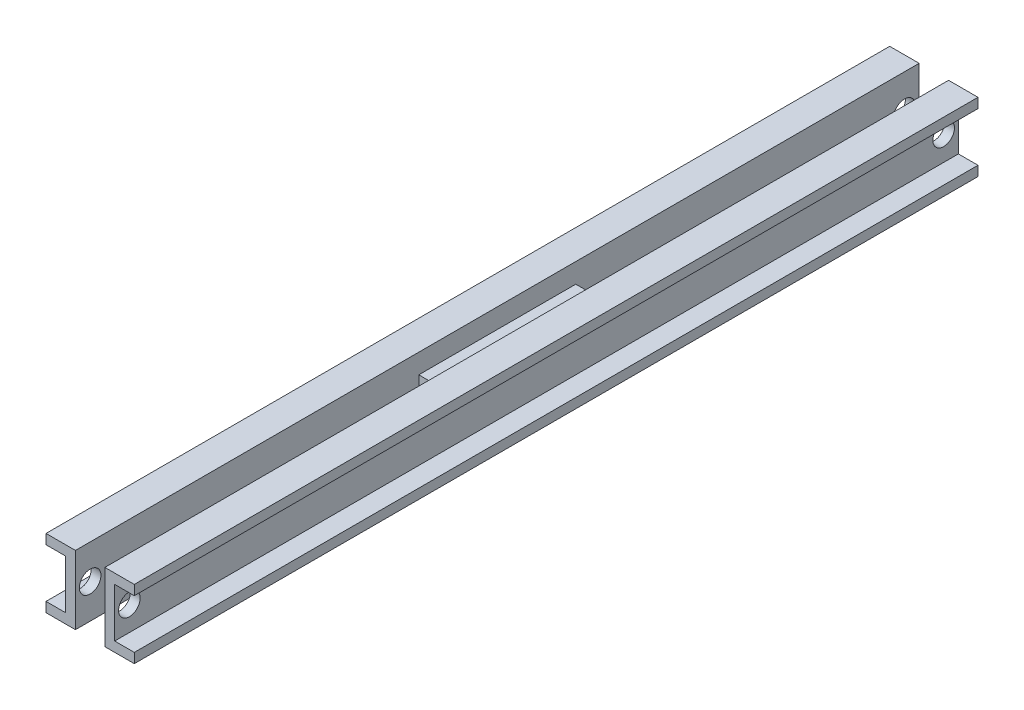
ISO-10303-21;
HEADER;
FILE_DESCRIPTION(('STEP AP214'),'2;1');
FILE_NAME('part.step','',(''),(''),'','','');
FILE_SCHEMA(('AUTOMOTIVE_DESIGN { 1 0 10303 214 1 1 1 1 }'));
ENDSEC;
DATA;
#1=APPLICATION_CONTEXT('core data for automotive mechanical design processes');
#2=APPLICATION_PROTOCOL_DEFINITION('international standard','automotive_design',2000,#1);
#3=PRODUCT_CONTEXT('',#1,'mechanical');
#4=PRODUCT('Part','Part','',(#3));
#5=PRODUCT_RELATED_PRODUCT_CATEGORY('part','',(#4));
#6=PRODUCT_DEFINITION_FORMATION('','',#4);
#7=PRODUCT_DEFINITION_CONTEXT('part definition',#1,'design');
#8=PRODUCT_DEFINITION('design','',#6,#7);
#9=PRODUCT_DEFINITION_SHAPE('','',#8);
#10=(LENGTH_UNIT() NAMED_UNIT(*) SI_UNIT(.MILLI.,.METRE.));
#11=(NAMED_UNIT(*) PLANE_ANGLE_UNIT() SI_UNIT($,.RADIAN.));
#12=(NAMED_UNIT(*) SI_UNIT($,.STERADIAN.) SOLID_ANGLE_UNIT());
#13=UNCERTAINTY_MEASURE_WITH_UNIT(LENGTH_MEASURE(1.E-05),#10,'distance_accuracy_value','');
#14=(GEOMETRIC_REPRESENTATION_CONTEXT(3) GLOBAL_UNCERTAINTY_ASSIGNED_CONTEXT((#13)) GLOBAL_UNIT_ASSIGNED_CONTEXT((#10,
#11,#12)) REPRESENTATION_CONTEXT('',''));
#15=CARTESIAN_POINT('',(0.,0.,0.));
#16=DIRECTION('',(0.,0.,1.));
#17=DIRECTION('',(1.,0.,0.));
#18=AXIS2_PLACEMENT_3D('',#15,#16,#17);
#19=CARTESIAN_POINT('',(0.,0.,-80.));
#20=DIRECTION('',(0.,0.,-1.));
#21=DIRECTION('',(-1.,0.,0.));
#22=AXIS2_PLACEMENT_3D('',#19,#20,#21);
#23=PLANE('',#22);
#24=DIRECTION('',(1.,0.,0.));
#25=VECTOR('',#24,1.);
#26=CARTESIAN_POINT('',(15.,-15.,-80.));
#27=LINE('',#26,#25);
#28=CARTESIAN_POINT('',(-15.,-15.,-80.));
#29=VERTEX_POINT('',#28);
#30=CARTESIAN_POINT('',(15.,-15.,-80.));
#31=VERTEX_POINT('',#30);
#32=EDGE_CURVE('E328',#29,#31,#27,.T.);
#33=ORIENTED_EDGE('',*,*,#32,.F.);
#34=DIRECTION('',(0.,1.,0.));
#35=VECTOR('',#34,1.);
#36=CARTESIAN_POINT('',(-15.,0.,-80.));
#37=LINE('',#36,#35);
#38=CARTESIAN_POINT('',(-15.,15.,-80.));
#39=VERTEX_POINT('',#38);
#40=EDGE_CURVE('E11',#29,#39,#37,.T.);
#41=ORIENTED_EDGE('',*,*,#40,.T.);
#42=DIRECTION('',(-1.,0.,0.));
#43=VECTOR('',#42,1.);
#44=CARTESIAN_POINT('',(15.,15.,-80.));
#45=LINE('',#44,#43);
#46=CARTESIAN_POINT('',(15.,15.,-80.));
#47=VERTEX_POINT('',#46);
#48=EDGE_CURVE('E336',#47,#39,#45,.T.);
#49=ORIENTED_EDGE('',*,*,#48,.F.);
#50=DIRECTION('',(0.,1.,0.));
#51=VECTOR('',#50,1.);
#52=CARTESIAN_POINT('',(15.,35.,-80.));
#53=LINE('',#52,#51);
#54=EDGE_CURVE('E49',#31,#47,#53,.T.);
#55=ORIENTED_EDGE('',*,*,#54,.F.);
#56=EDGE_LOOP('',(#33,#41,#49,#55));
#57=FACE_BOUND('',#56,.T.);
#58=ADVANCED_FACE('F39',(#57),#23,.T.);
#59=CARTESIAN_POINT('',(0.,0.,80.));
#60=DIRECTION('',(0.,0.,-1.));
#61=DIRECTION('',(-1.,0.,0.));
#62=AXIS2_PLACEMENT_3D('',#59,#60,#61);
#63=PLANE('',#62);
#64=DIRECTION('',(0.,-1.,0.));
#65=VECTOR('',#64,1.);
#66=CARTESIAN_POINT('',(15.,35.,80.));
#67=LINE('',#66,#65);
#68=CARTESIAN_POINT('',(15.,15.,80.));
#69=VERTEX_POINT('',#68);
#70=CARTESIAN_POINT('',(15.,-15.,80.));
#71=VERTEX_POINT('',#70);
#72=EDGE_CURVE('E259',#69,#71,#67,.T.);
#73=ORIENTED_EDGE('',*,*,#72,.F.);
#74=DIRECTION('',(-1.,0.,0.));
#75=VECTOR('',#74,1.);
#76=CARTESIAN_POINT('',(15.,15.,80.));
#77=LINE('',#76,#75);
#78=CARTESIAN_POINT('',(-15.,15.,80.));
#79=VERTEX_POINT('',#78);
#80=EDGE_CURVE('E56',#69,#79,#77,.T.);
#81=ORIENTED_EDGE('',*,*,#80,.T.);
#82=DIRECTION('',(0.,1.,0.));
#83=VECTOR('',#82,1.);
#84=CARTESIAN_POINT('',(-15.,35.,80.));
#85=LINE('',#84,#83);
#86=CARTESIAN_POINT('',(-15.,-15.,80.));
#87=VERTEX_POINT('',#86);
#88=EDGE_CURVE('E263',#87,#79,#85,.T.);
#89=ORIENTED_EDGE('',*,*,#88,.F.);
#90=DIRECTION('',(1.,0.,0.));
#91=VECTOR('',#90,1.);
#92=CARTESIAN_POINT('',(15.,-15.,80.));
#93=LINE('',#92,#91);
#94=EDGE_CURVE('E333',#87,#71,#93,.T.);
#95=ORIENTED_EDGE('',*,*,#94,.T.);
#96=EDGE_LOOP('',(#73,#81,#89,#95));
#97=FACE_BOUND('',#96,.T.);
#98=ADVANCED_FACE('F428',(#97),#63,.F.);
#99=CARTESIAN_POINT('',(15.,-15.,80.));
#100=DIRECTION('',(0.,1.,0.));
#101=DIRECTION('',(0.,0.,1.));
#102=AXIS2_PLACEMENT_3D('',#99,#100,#101);
#103=PLANE('',#102);
#104=ORIENTED_EDGE('',*,*,#32,.T.);
#105=DIRECTION('',(0.,0.,-1.));
#106=VECTOR('',#105,1.);
#107=CARTESIAN_POINT('',(15.,-15.,80.));
#108=LINE('',#107,#106);
#109=EDGE_CURVE('E396',#71,#31,#108,.T.);
#110=ORIENTED_EDGE('',*,*,#109,.F.);
#111=ORIENTED_EDGE('',*,*,#94,.F.);
#112=DIRECTION('',(0.,0.,-1.));
#113=VECTOR('',#112,1.);
#114=CARTESIAN_POINT('',(-15.,-15.,80.));
#115=LINE('',#114,#113);
#116=EDGE_CURVE('E332',#87,#29,#115,.T.);
#117=ORIENTED_EDGE('',*,*,#116,.T.);
#118=EDGE_LOOP('',(#104,#110,#111,#117));
#119=FACE_BOUND('',#118,.T.);
#120=ADVANCED_FACE('F41',(#119),#103,.F.);
#121=CARTESIAN_POINT('',(15.,-35.,80.));
#122=DIRECTION('',(0.,1.,0.));
#123=DIRECTION('',(0.,0.,1.));
#124=AXIS2_PLACEMENT_3D('',#121,#122,#123);
#125=PLANE('',#124);
#126=DIRECTION('',(0.,0.,-1.));
#127=VECTOR('',#126,1.);
#128=CARTESIAN_POINT('',(15.,-35.,80.));
#129=LINE('',#128,#127);
#130=CARTESIAN_POINT('',(15.,-35.,430.));
#131=VERTEX_POINT('',#130);
#132=CARTESIAN_POINT('',(15.,-35.,-430.));
#133=VERTEX_POINT('',#132);
#134=EDGE_CURVE('E393',#131,#133,#129,.T.);
#135=ORIENTED_EDGE('',*,*,#134,.T.);
#136=DIRECTION('',(-1.,0.,0.));
#137=VECTOR('',#136,1.);
#138=CARTESIAN_POINT('',(45.,-35.,-430.));
#139=LINE('',#138,#137);
#140=CARTESIAN_POINT('',(45.,-35.,-430.));
#141=VERTEX_POINT('',#140);
#142=EDGE_CURVE('E247',#141,#133,#139,.T.);
#143=ORIENTED_EDGE('',*,*,#142,.F.);
#144=DIRECTION('',(0.,0.,-1.));
#145=VECTOR('',#144,1.);
#146=CARTESIAN_POINT('',(45.,-35.,80.));
#147=LINE('',#146,#145);
#148=CARTESIAN_POINT('',(45.,-35.,430.));
#149=VERTEX_POINT('',#148);
#150=EDGE_CURVE('E390',#149,#141,#147,.T.);
#151=ORIENTED_EDGE('',*,*,#150,.F.);
#152=DIRECTION('',(1.,0.,0.));
#153=VECTOR('',#152,1.);
#154=CARTESIAN_POINT('',(15.,-35.,430.));
#155=LINE('',#154,#153);
#156=EDGE_CURVE('E268',#131,#149,#155,.T.);
#157=ORIENTED_EDGE('',*,*,#156,.F.);
#158=EDGE_LOOP('',(#135,#143,#151,#157));
#159=FACE_BOUND('',#158,.T.);
#160=ADVANCED_FACE('F692',(#159),#125,.F.);
#161=CARTESIAN_POINT('',(45.,-25.,80.));
#162=DIRECTION('',(-1.,0.,0.));
#163=DIRECTION('',(0.,-1.,0.));
#164=AXIS2_PLACEMENT_3D('',#161,#162,#163);
#165=PLANE('',#164);
#166=ORIENTED_EDGE('',*,*,#150,.T.);
#167=DIRECTION('',(0.,-1.,0.));
#168=VECTOR('',#167,1.);
#169=CARTESIAN_POINT('',(45.,-25.,-430.));
#170=LINE('',#169,#168);
#171=CARTESIAN_POINT('',(45.,-25.,-430.));
#172=VERTEX_POINT('',#171);
#173=EDGE_CURVE('E243',#172,#141,#170,.T.);
#174=ORIENTED_EDGE('',*,*,#173,.F.);
#175=DIRECTION('',(0.,0.,-1.));
#176=VECTOR('',#175,1.);
#177=CARTESIAN_POINT('',(45.,-25.,80.));
#178=LINE('',#177,#176);
#179=CARTESIAN_POINT('',(45.,-25.,430.));
#180=VERTEX_POINT('',#179);
#181=EDGE_CURVE('E387',#180,#172,#178,.T.);
#182=ORIENTED_EDGE('',*,*,#181,.F.);
#183=DIRECTION('',(0.,1.,0.));
#184=VECTOR('',#183,1.);
#185=CARTESIAN_POINT('',(45.,-25.,430.));
#186=LINE('',#185,#184);
#187=EDGE_CURVE('E272',#149,#180,#186,.T.);
#188=ORIENTED_EDGE('',*,*,#187,.F.);
#189=EDGE_LOOP('',(#166,#174,#182,#188));
#190=FACE_BOUND('',#189,.T.);
#191=ADVANCED_FACE('F679',(#190),#165,.F.);
#192=CARTESIAN_POINT('',(45.,-25.,80.));
#193=DIRECTION('',(0.,-1.,0.));
#194=DIRECTION('',(1.,0.,0.));
#195=AXIS2_PLACEMENT_3D('',#192,#193,#194);
#196=PLANE('',#195);
#197=ORIENTED_EDGE('',*,*,#181,.T.);
#198=DIRECTION('',(1.,0.,0.));
#199=VECTOR('',#198,1.);
#200=CARTESIAN_POINT('',(45.,-25.,-430.));
#201=LINE('',#200,#199);
#202=CARTESIAN_POINT('',(25.,-25.,-430.));
#203=VERTEX_POINT('',#202);
#204=EDGE_CURVE('E239',#203,#172,#201,.T.);
#205=ORIENTED_EDGE('',*,*,#204,.F.);
#206=DIRECTION('',(0.,0.,-1.));
#207=VECTOR('',#206,1.);
#208=CARTESIAN_POINT('',(25.,-25.,80.));
#209=LINE('',#208,#207);
#210=CARTESIAN_POINT('',(25.,-25.,430.));
#211=VERTEX_POINT('',#210);
#212=EDGE_CURVE('E384',#211,#203,#209,.T.);
#213=ORIENTED_EDGE('',*,*,#212,.F.);
#214=DIRECTION('',(-1.,0.,0.));
#215=VECTOR('',#214,1.);
#216=CARTESIAN_POINT('',(45.,-25.,430.));
#217=LINE('',#216,#215);
#218=EDGE_CURVE('E276',#180,#211,#217,.T.);
#219=ORIENTED_EDGE('',*,*,#218,.F.);
#220=EDGE_LOOP('',(#197,#205,#213,#219));
#221=FACE_BOUND('',#220,.T.);
#222=ADVANCED_FACE('F667',(#221),#196,.F.);
#223=CARTESIAN_POINT('',(25.,25.,80.));
#224=DIRECTION('',(-1.,0.,0.));
#225=DIRECTION('',(0.,-1.,0.));
#226=AXIS2_PLACEMENT_3D('',#223,#224,#225);
#227=PLANE('',#226);
#228=CARTESIAN_POINT('',(25.,0.,-415.));
#229=DIRECTION('',(-1.,0.,0.));
#230=DIRECTION('',(0.,-1.,0.));
#231=AXIS2_PLACEMENT_3D('',#228,#229,#230);
#232=CIRCLE('',#231,11.);
#233=CARTESIAN_POINT('',(25.,-11.,-415.));
#234=VERTEX_POINT('',#233);
#235=EDGE_CURVE('E200',#234,#234,#232,.T.);
#236=ORIENTED_EDGE('',*,*,#235,.T.);
#237=EDGE_LOOP('',(#236));
#238=FACE_BOUND('',#237,.T.);
#239=CARTESIAN_POINT('',(25.,0.,415.));
#240=DIRECTION('',(-1.,0.,0.));
#241=DIRECTION('',(0.,-1.,0.));
#242=AXIS2_PLACEMENT_3D('',#239,#240,#241);
#243=CIRCLE('',#242,11.);
#244=CARTESIAN_POINT('',(25.,-11.,415.));
#245=VERTEX_POINT('',#244);
#246=EDGE_CURVE('E801',#245,#245,#243,.T.);
#247=ORIENTED_EDGE('',*,*,#246,.T.);
#248=EDGE_LOOP('',(#247));
#249=FACE_BOUND('',#248,.T.);
#250=ORIENTED_EDGE('',*,*,#212,.T.);
#251=DIRECTION('',(0.,-1.,0.));
#252=VECTOR('',#251,1.);
#253=CARTESIAN_POINT('',(25.,25.,-430.));
#254=LINE('',#253,#252);
#255=CARTESIAN_POINT('',(25.,25.,-430.));
#256=VERTEX_POINT('',#255);
#257=EDGE_CURVE('E235',#256,#203,#254,.T.);
#258=ORIENTED_EDGE('',*,*,#257,.F.);
#259=DIRECTION('',(0.,0.,-1.));
#260=VECTOR('',#259,1.);
#261=CARTESIAN_POINT('',(25.,25.,80.));
#262=LINE('',#261,#260);
#263=CARTESIAN_POINT('',(25.,25.,430.));
#264=VERTEX_POINT('',#263);
#265=EDGE_CURVE('E381',#264,#256,#262,.T.);
#266=ORIENTED_EDGE('',*,*,#265,.F.);
#267=DIRECTION('',(0.,1.,0.));
#268=VECTOR('',#267,1.);
#269=CARTESIAN_POINT('',(25.,25.,430.));
#270=LINE('',#269,#268);
#271=EDGE_CURVE('E280',#211,#264,#270,.T.);
#272=ORIENTED_EDGE('',*,*,#271,.F.);
#273=EDGE_LOOP('',(#250,#258,#266,#272));
#274=FACE_BOUND('',#273,.T.);
#275=ADVANCED_FACE('F654',(#238,#249,#274),#227,.F.);
#276=CARTESIAN_POINT('',(45.,25.,80.));
#277=DIRECTION('',(0.,1.,0.));
#278=DIRECTION('',(-1.,0.,0.));
#279=AXIS2_PLACEMENT_3D('',#276,#277,#278);
#280=PLANE('',#279);
#281=ORIENTED_EDGE('',*,*,#265,.T.);
#282=DIRECTION('',(-1.,0.,0.));
#283=VECTOR('',#282,1.);
#284=CARTESIAN_POINT('',(45.,25.,-430.));
#285=LINE('',#284,#283);
#286=CARTESIAN_POINT('',(45.,25.,-430.));
#287=VERTEX_POINT('',#286);
#288=EDGE_CURVE('E231',#287,#256,#285,.T.);
#289=ORIENTED_EDGE('',*,*,#288,.F.);
#290=DIRECTION('',(0.,0.,-1.));
#291=VECTOR('',#290,1.);
#292=CARTESIAN_POINT('',(45.,25.,80.));
#293=LINE('',#292,#291);
#294=CARTESIAN_POINT('',(45.,25.,430.));
#295=VERTEX_POINT('',#294);
#296=EDGE_CURVE('E378',#295,#287,#293,.T.);
#297=ORIENTED_EDGE('',*,*,#296,.F.);
#298=DIRECTION('',(1.,0.,0.));
#299=VECTOR('',#298,1.);
#300=CARTESIAN_POINT('',(45.,25.,430.));
#301=LINE('',#300,#299);
#302=EDGE_CURVE('E284',#264,#295,#301,.T.);
#303=ORIENTED_EDGE('',*,*,#302,.F.);
#304=EDGE_LOOP('',(#281,#289,#297,#303));
#305=FACE_BOUND('',#304,.T.);
#306=ADVANCED_FACE('F641',(#305),#280,.F.);
#307=CARTESIAN_POINT('',(45.,35.,80.));
#308=DIRECTION('',(-1.,0.,0.));
#309=DIRECTION('',(0.,-1.,0.));
#310=AXIS2_PLACEMENT_3D('',#307,#308,#309);
#311=PLANE('',#310);
#312=ORIENTED_EDGE('',*,*,#296,.T.);
#313=DIRECTION('',(0.,-1.,0.));
#314=VECTOR('',#313,1.);
#315=CARTESIAN_POINT('',(45.,35.,-430.));
#316=LINE('',#315,#314);
#317=CARTESIAN_POINT('',(45.,35.,-430.));
#318=VERTEX_POINT('',#317);
#319=EDGE_CURVE('E227',#318,#287,#316,.T.);
#320=ORIENTED_EDGE('',*,*,#319,.F.);
#321=DIRECTION('',(0.,0.,-1.));
#322=VECTOR('',#321,1.);
#323=CARTESIAN_POINT('',(45.,35.,80.));
#324=LINE('',#323,#322);
#325=CARTESIAN_POINT('',(45.,35.,430.));
#326=VERTEX_POINT('',#325);
#327=EDGE_CURVE('E375',#326,#318,#324,.T.);
#328=ORIENTED_EDGE('',*,*,#327,.F.);
#329=DIRECTION('',(0.,1.,0.));
#330=VECTOR('',#329,1.);
#331=CARTESIAN_POINT('',(45.,35.,430.));
#332=LINE('',#331,#330);
#333=EDGE_CURVE('E288',#295,#326,#332,.T.);
#334=ORIENTED_EDGE('',*,*,#333,.F.);
#335=EDGE_LOOP('',(#312,#320,#328,#334));
#336=FACE_BOUND('',#335,.T.);
#337=ADVANCED_FACE('F628',(#336),#311,.F.);
#338=CARTESIAN_POINT('',(15.,35.,80.));
#339=DIRECTION('',(0.,-1.,0.));
#340=DIRECTION('',(0.,0.,-1.));
#341=AXIS2_PLACEMENT_3D('',#338,#339,#340);
#342=PLANE('',#341);
#343=ORIENTED_EDGE('',*,*,#327,.T.);
#344=DIRECTION('',(1.,0.,0.));
#345=VECTOR('',#344,1.);
#346=CARTESIAN_POINT('',(45.,35.,-430.));
#347=LINE('',#346,#345);
#348=CARTESIAN_POINT('',(15.,35.,-430.));
#349=VERTEX_POINT('',#348);
#350=EDGE_CURVE('E255',#349,#318,#347,.T.);
#351=ORIENTED_EDGE('',*,*,#350,.F.);
#352=DIRECTION('',(0.,0.,-1.));
#353=VECTOR('',#352,1.);
#354=CARTESIAN_POINT('',(15.,35.,80.));
#355=LINE('',#354,#353);
#356=CARTESIAN_POINT('',(15.,35.,430.));
#357=VERTEX_POINT('',#356);
#358=EDGE_CURVE('E372',#357,#349,#355,.T.);
#359=ORIENTED_EDGE('',*,*,#358,.F.);
#360=DIRECTION('',(-1.,0.,0.));
#361=VECTOR('',#360,1.);
#362=CARTESIAN_POINT('',(15.,35.,430.));
#363=LINE('',#362,#361);
#364=EDGE_CURVE('E292',#326,#357,#363,.T.);
#365=ORIENTED_EDGE('',*,*,#364,.F.);
#366=EDGE_LOOP('',(#343,#351,#359,#365));
#367=FACE_BOUND('',#366,.T.);
#368=ADVANCED_FACE('F424',(#367),#342,.F.);
#369=CARTESIAN_POINT('',(15.,35.,80.));
#370=DIRECTION('',(1.,0.,0.));
#371=DIRECTION('',(0.,1.,0.));
#372=AXIS2_PLACEMENT_3D('',#369,#370,#371);
#373=PLANE('',#372);
#374=CARTESIAN_POINT('',(15.,0.,-415.));
#375=DIRECTION('',(1.,0.,0.));
#376=DIRECTION('',(0.,1.,0.));
#377=AXIS2_PLACEMENT_3D('',#374,#375,#376);
#378=CIRCLE('',#377,11.);
#379=CARTESIAN_POINT('',(15.,11.,-415.));
#380=VERTEX_POINT('',#379);
#381=EDGE_CURVE('E204',#380,#380,#378,.T.);
#382=ORIENTED_EDGE('',*,*,#381,.T.);
#383=EDGE_LOOP('',(#382));
#384=FACE_BOUND('',#383,.T.);
#385=CARTESIAN_POINT('',(15.,0.,415.));
#386=DIRECTION('',(1.,0.,0.));
#387=DIRECTION('',(0.,1.,0.));
#388=AXIS2_PLACEMENT_3D('',#385,#386,#387);
#389=CIRCLE('',#388,11.);
#390=CARTESIAN_POINT('',(15.,11.,415.));
#391=VERTEX_POINT('',#390);
#392=EDGE_CURVE('E805',#391,#391,#389,.T.);
#393=ORIENTED_EDGE('',*,*,#392,.T.);
#394=EDGE_LOOP('',(#393));
#395=FACE_BOUND('',#394,.T.);
#396=DIRECTION('',(0.,1.,0.));
#397=VECTOR('',#396,1.);
#398=CARTESIAN_POINT('',(15.,35.,-430.));
#399=LINE('',#398,#397);
#400=EDGE_CURVE('E251',#133,#349,#399,.T.);
#401=ORIENTED_EDGE('',*,*,#400,.F.);
#402=ORIENTED_EDGE('',*,*,#134,.F.);
#403=DIRECTION('',(0.,-1.,0.));
#404=VECTOR('',#403,1.);
#405=CARTESIAN_POINT('',(15.,35.,430.));
#406=LINE('',#405,#404);
#407=EDGE_CURVE('E264',#357,#131,#406,.T.);
#408=ORIENTED_EDGE('',*,*,#407,.F.);
#409=ORIENTED_EDGE('',*,*,#358,.T.);
#410=EDGE_LOOP('',(#401,#402,#408,#409));
#411=FACE_BOUND('',#410,.T.);
#412=ORIENTED_EDGE('',*,*,#109,.T.);
#413=ORIENTED_EDGE('',*,*,#54,.T.);
#414=DIRECTION('',(0.,0.,-1.));
#415=VECTOR('',#414,1.);
#416=CARTESIAN_POINT('',(15.,15.,80.));
#417=LINE('',#416,#415);
#418=EDGE_CURVE('E368',#69,#47,#417,.T.);
#419=ORIENTED_EDGE('',*,*,#418,.F.);
#420=ORIENTED_EDGE('',*,*,#72,.T.);
#421=EDGE_LOOP('',(#412,#413,#419,#420));
#422=FACE_BOUND('',#421,.T.);
#423=ADVANCED_FACE('F413',(#384,#395,#411,#422),#373,.F.);
#424=CARTESIAN_POINT('',(15.,15.,80.));
#425=DIRECTION('',(0.,-1.,0.));
#426=DIRECTION('',(0.,0.,-1.));
#427=AXIS2_PLACEMENT_3D('',#424,#425,#426);
#428=PLANE('',#427);
#429=ORIENTED_EDGE('',*,*,#48,.T.);
#430=DIRECTION('',(0.,0.,-1.));
#431=VECTOR('',#430,1.);
#432=CARTESIAN_POINT('',(-15.,15.,80.));
#433=LINE('',#432,#431);
#434=EDGE_CURVE('E364',#79,#39,#433,.T.);
#435=ORIENTED_EDGE('',*,*,#434,.F.);
#436=ORIENTED_EDGE('',*,*,#80,.F.);
#437=ORIENTED_EDGE('',*,*,#418,.T.);
#438=EDGE_LOOP('',(#429,#435,#436,#437));
#439=FACE_BOUND('',#438,.T.);
#440=ADVANCED_FACE('F415',(#439),#428,.F.);
#441=CARTESIAN_POINT('',(-15.,35.,80.));
#442=DIRECTION('',(-1.,0.,0.));
#443=DIRECTION('',(0.,-1.,0.));
#444=AXIS2_PLACEMENT_3D('',#441,#442,#443);
#445=PLANE('',#444);
#446=CARTESIAN_POINT('',(-15.,0.,-415.));
#447=DIRECTION('',(-1.,0.,0.));
#448=DIRECTION('',(0.,-1.,0.));
#449=AXIS2_PLACEMENT_3D('',#446,#447,#448);
#450=CIRCLE('',#449,11.);
#451=CARTESIAN_POINT('',(-15.,-11.,-415.));
#452=VERTEX_POINT('',#451);
#453=EDGE_CURVE('E804',#452,#452,#450,.T.);
#454=ORIENTED_EDGE('',*,*,#453,.T.);
#455=EDGE_LOOP('',(#454));
#456=FACE_BOUND('',#455,.T.);
#457=CARTESIAN_POINT('',(-15.,0.,415.));
#458=DIRECTION('',(-1.,0.,0.));
#459=DIRECTION('',(0.,-1.,0.));
#460=AXIS2_PLACEMENT_3D('',#457,#458,#459);
#461=CIRCLE('',#460,11.);
#462=CARTESIAN_POINT('',(-15.,-11.,415.));
#463=VERTEX_POINT('',#462);
#464=EDGE_CURVE('E812',#463,#463,#461,.T.);
#465=ORIENTED_EDGE('',*,*,#464,.T.);
#466=EDGE_LOOP('',(#465));
#467=FACE_BOUND('',#466,.T.);
#468=ORIENTED_EDGE('',*,*,#40,.F.);
#469=ORIENTED_EDGE('',*,*,#116,.F.);
#470=ORIENTED_EDGE('',*,*,#88,.T.);
#471=ORIENTED_EDGE('',*,*,#434,.T.);
#472=EDGE_LOOP('',(#468,#469,#470,#471));
#473=FACE_BOUND('',#472,.T.);
#474=DIRECTION('',(0.,0.,-1.));
#475=VECTOR('',#474,1.);
#476=CARTESIAN_POINT('',(-15.,-35.,80.));
#477=LINE('',#476,#475);
#478=CARTESIAN_POINT('',(-15.,-35.,430.));
#479=VERTEX_POINT('',#478);
#480=CARTESIAN_POINT('',(-15.,-35.,-430.));
#481=VERTEX_POINT('',#480);
#482=EDGE_CURVE('E339',#479,#481,#477,.T.);
#483=ORIENTED_EDGE('',*,*,#482,.T.);
#484=DIRECTION('',(0.,-1.,0.));
#485=VECTOR('',#484,1.);
#486=CARTESIAN_POINT('',(-15.,35.,-430.));
#487=LINE('',#486,#485);
#488=CARTESIAN_POINT('',(-15.,35.,-430.));
#489=VERTEX_POINT('',#488);
#490=EDGE_CURVE('E192',#489,#481,#487,.T.);
#491=ORIENTED_EDGE('',*,*,#490,.F.);
#492=DIRECTION('',(0.,0.,-1.));
#493=VECTOR('',#492,1.);
#494=CARTESIAN_POINT('',(-15.,35.,80.));
#495=LINE('',#494,#493);
#496=CARTESIAN_POINT('',(-15.,35.,430.));
#497=VERTEX_POINT('',#496);
#498=EDGE_CURVE('E182',#497,#489,#495,.T.);
#499=ORIENTED_EDGE('',*,*,#498,.F.);
#500=DIRECTION('',(0.,1.,0.));
#501=VECTOR('',#500,1.);
#502=CARTESIAN_POINT('',(-15.,35.,430.));
#503=LINE('',#502,#501);
#504=EDGE_CURVE('E321',#479,#497,#503,.T.);
#505=ORIENTED_EDGE('',*,*,#504,.F.);
#506=EDGE_LOOP('',(#483,#491,#499,#505));
#507=FACE_BOUND('',#506,.T.);
#508=ADVANCED_FACE('F407',(#456,#467,#473,#507),#445,.F.);
#509=CARTESIAN_POINT('',(-15.,35.,80.));
#510=DIRECTION('',(0.,-1.,0.));
#511=DIRECTION('',(1.,0.,0.));
#512=AXIS2_PLACEMENT_3D('',#509,#510,#511);
#513=PLANE('',#512);
#514=ORIENTED_EDGE('',*,*,#498,.T.);
#515=DIRECTION('',(1.,0.,0.));
#516=VECTOR('',#515,1.);
#517=CARTESIAN_POINT('',(-45.,35.,-430.));
#518=LINE('',#517,#516);
#519=CARTESIAN_POINT('',(-45.,35.,-430.));
#520=VERTEX_POINT('',#519);
#521=EDGE_CURVE('E186',#520,#489,#518,.T.);
#522=ORIENTED_EDGE('',*,*,#521,.F.);
#523=DIRECTION('',(0.,0.,-1.));
#524=VECTOR('',#523,1.);
#525=CARTESIAN_POINT('',(-45.,35.,80.));
#526=LINE('',#525,#524);
#527=CARTESIAN_POINT('',(-45.,35.,430.));
#528=VERTEX_POINT('',#527);
#529=EDGE_CURVE('E171',#528,#520,#526,.T.);
#530=ORIENTED_EDGE('',*,*,#529,.F.);
#531=DIRECTION('',(-1.,0.,0.));
#532=VECTOR('',#531,1.);
#533=CARTESIAN_POINT('',(-45.,35.,430.));
#534=LINE('',#533,#532);
#535=EDGE_CURVE('E325',#497,#528,#534,.T.);
#536=ORIENTED_EDGE('',*,*,#535,.F.);
#537=EDGE_LOOP('',(#514,#522,#530,#536));
#538=FACE_BOUND('',#537,.T.);
#539=ADVANCED_FACE('F187',(#538),#513,.F.);
#540=CARTESIAN_POINT('',(-45.,35.,80.));
#541=DIRECTION('',(1.,0.,0.));
#542=DIRECTION('',(0.,0.,-1.));
#543=AXIS2_PLACEMENT_3D('',#540,#541,#542);
#544=PLANE('',#543);
#545=ORIENTED_EDGE('',*,*,#529,.T.);
#546=DIRECTION('',(0.,1.,0.));
#547=VECTOR('',#546,1.);
#548=CARTESIAN_POINT('',(-45.,35.,-430.));
#549=LINE('',#548,#547);
#550=CARTESIAN_POINT('',(-45.,25.,-430.));
#551=VERTEX_POINT('',#550);
#552=EDGE_CURVE('E175',#551,#520,#549,.T.);
#553=ORIENTED_EDGE('',*,*,#552,.F.);
#554=DIRECTION('',(0.,0.,-1.));
#555=VECTOR('',#554,1.);
#556=CARTESIAN_POINT('',(-45.,25.,80.));
#557=LINE('',#556,#555);
#558=CARTESIAN_POINT('',(-45.,25.,430.));
#559=VERTEX_POINT('',#558);
#560=EDGE_CURVE('E183',#559,#551,#557,.T.);
#561=ORIENTED_EDGE('',*,*,#560,.F.);
#562=DIRECTION('',(0.,-1.,0.));
#563=VECTOR('',#562,1.);
#564=CARTESIAN_POINT('',(-45.,35.,430.));
#565=LINE('',#564,#563);
#566=EDGE_CURVE('E177',#528,#559,#565,.T.);
#567=ORIENTED_EDGE('',*,*,#566,.F.);
#568=EDGE_LOOP('',(#545,#553,#561,#567));
#569=FACE_BOUND('',#568,.T.);
#570=ADVANCED_FACE('F173',(#569),#544,.F.);
#571=CARTESIAN_POINT('',(-45.,25.,80.));
#572=DIRECTION('',(0.,1.,0.));
#573=DIRECTION('',(0.,0.,1.));
#574=AXIS2_PLACEMENT_3D('',#571,#572,#573);
#575=PLANE('',#574);
#576=ORIENTED_EDGE('',*,*,#560,.T.);
#577=DIRECTION('',(-1.,0.,0.));
#578=VECTOR('',#577,1.);
#579=CARTESIAN_POINT('',(-25.,25.,-430.));
#580=LINE('',#579,#578);
#581=CARTESIAN_POINT('',(-25.,25.,-430.));
#582=VERTEX_POINT('',#581);
#583=EDGE_CURVE('E198',#582,#551,#580,.T.);
#584=ORIENTED_EDGE('',*,*,#583,.F.);
#585=DIRECTION('',(0.,0.,-1.));
#586=VECTOR('',#585,1.);
#587=CARTESIAN_POINT('',(-25.,25.,80.));
#588=LINE('',#587,#586);
#589=CARTESIAN_POINT('',(-25.,25.,430.));
#590=VERTEX_POINT('',#589);
#591=EDGE_CURVE('E357',#590,#582,#588,.T.);
#592=ORIENTED_EDGE('',*,*,#591,.F.);
#593=DIRECTION('',(1.,0.,0.));
#594=VECTOR('',#593,1.);
#595=CARTESIAN_POINT('',(-45.,25.,430.));
#596=LINE('',#595,#594);
#597=EDGE_CURVE('E301',#559,#590,#596,.T.);
#598=ORIENTED_EDGE('',*,*,#597,.F.);
#599=EDGE_LOOP('',(#576,#584,#592,#598));
#600=FACE_BOUND('',#599,.T.);
#601=ADVANCED_FACE('F452',(#600),#575,.F.);
#602=CARTESIAN_POINT('',(-25.,25.,80.));
#603=DIRECTION('',(1.,0.,0.));
#604=DIRECTION('',(0.,1.,0.));
#605=AXIS2_PLACEMENT_3D('',#602,#603,#604);
#606=PLANE('',#605);
#607=CARTESIAN_POINT('',(-25.,0.,-415.));
#608=DIRECTION('',(-1.,0.,0.));
#609=DIRECTION('',(0.,-1.,0.));
#610=AXIS2_PLACEMENT_3D('',#607,#608,#609);
#611=CIRCLE('',#610,11.);
#612=CARTESIAN_POINT('',(-25.,-11.,-415.));
#613=VERTEX_POINT('',#612);
#614=EDGE_CURVE('E824',#613,#613,#611,.T.);
#615=ORIENTED_EDGE('',*,*,#614,.F.);
#616=EDGE_LOOP('',(#615));
#617=FACE_BOUND('',#616,.T.);
#618=CARTESIAN_POINT('',(-25.,0.,415.));
#619=DIRECTION('',(-1.,0.,0.));
#620=DIRECTION('',(0.,-1.,0.));
#621=AXIS2_PLACEMENT_3D('',#618,#619,#620);
#622=CIRCLE('',#621,11.);
#623=CARTESIAN_POINT('',(-25.,-11.,415.));
#624=VERTEX_POINT('',#623);
#625=EDGE_CURVE('E825',#624,#624,#622,.T.);
#626=ORIENTED_EDGE('',*,*,#625,.F.);
#627=EDGE_LOOP('',(#626));
#628=FACE_BOUND('',#627,.T.);
#629=ORIENTED_EDGE('',*,*,#591,.T.);
#630=DIRECTION('',(0.,1.,0.));
#631=VECTOR('',#630,1.);
#632=CARTESIAN_POINT('',(-25.,25.,-430.));
#633=LINE('',#632,#631);
#634=CARTESIAN_POINT('',(-25.,-25.,-430.));
#635=VERTEX_POINT('',#634);
#636=EDGE_CURVE('E222',#635,#582,#633,.T.);
#637=ORIENTED_EDGE('',*,*,#636,.F.);
#638=DIRECTION('',(0.,0.,-1.));
#639=VECTOR('',#638,1.);
#640=CARTESIAN_POINT('',(-25.,-25.,80.));
#641=LINE('',#640,#639);
#642=CARTESIAN_POINT('',(-25.,-25.,430.));
#643=VERTEX_POINT('',#642);
#644=EDGE_CURVE('E354',#643,#635,#641,.T.);
#645=ORIENTED_EDGE('',*,*,#644,.F.);
#646=DIRECTION('',(0.,-1.,0.));
#647=VECTOR('',#646,1.);
#648=CARTESIAN_POINT('',(-25.,25.,430.));
#649=LINE('',#648,#647);
#650=EDGE_CURVE('E305',#590,#643,#649,.T.);
#651=ORIENTED_EDGE('',*,*,#650,.F.);
#652=EDGE_LOOP('',(#629,#637,#645,#651));
#653=FACE_BOUND('',#652,.T.);
#654=ADVANCED_FACE('F448',(#617,#628,#653),#606,.F.);
#655=CARTESIAN_POINT('',(-45.,-25.,80.));
#656=DIRECTION('',(0.,-1.,0.));
#657=DIRECTION('',(0.,0.,-1.));
#658=AXIS2_PLACEMENT_3D('',#655,#656,#657);
#659=PLANE('',#658);
#660=ORIENTED_EDGE('',*,*,#644,.T.);
#661=DIRECTION('',(1.,0.,0.));
#662=VECTOR('',#661,1.);
#663=CARTESIAN_POINT('',(-25.,-25.,-430.));
#664=LINE('',#663,#662);
#665=CARTESIAN_POINT('',(-45.,-25.,-430.));
#666=VERTEX_POINT('',#665);
#667=EDGE_CURVE('E218',#666,#635,#664,.T.);
#668=ORIENTED_EDGE('',*,*,#667,.F.);
#669=DIRECTION('',(0.,0.,-1.));
#670=VECTOR('',#669,1.);
#671=CARTESIAN_POINT('',(-45.,-25.,80.));
#672=LINE('',#671,#670);
#673=CARTESIAN_POINT('',(-45.,-25.,430.));
#674=VERTEX_POINT('',#673);
#675=EDGE_CURVE('E351',#674,#666,#672,.T.);
#676=ORIENTED_EDGE('',*,*,#675,.F.);
#677=DIRECTION('',(-1.,0.,0.));
#678=VECTOR('',#677,1.);
#679=CARTESIAN_POINT('',(-45.,-25.,430.));
#680=LINE('',#679,#678);
#681=EDGE_CURVE('E309',#643,#674,#680,.T.);
#682=ORIENTED_EDGE('',*,*,#681,.F.);
#683=EDGE_LOOP('',(#660,#668,#676,#682));
#684=FACE_BOUND('',#683,.T.);
#685=ADVANCED_FACE('F444',(#684),#659,.F.);
#686=CARTESIAN_POINT('',(-45.,-25.,80.));
#687=DIRECTION('',(1.,0.,0.));
#688=DIRECTION('',(0.,1.,0.));
#689=AXIS2_PLACEMENT_3D('',#686,#687,#688);
#690=PLANE('',#689);
#691=ORIENTED_EDGE('',*,*,#675,.T.);
#692=DIRECTION('',(0.,1.,0.));
#693=VECTOR('',#692,1.);
#694=CARTESIAN_POINT('',(-45.,-25.,-430.));
#695=LINE('',#694,#693);
#696=CARTESIAN_POINT('',(-45.,-35.,-430.));
#697=VERTEX_POINT('',#696);
#698=EDGE_CURVE('E214',#697,#666,#695,.T.);
#699=ORIENTED_EDGE('',*,*,#698,.F.);
#700=DIRECTION('',(0.,0.,-1.));
#701=VECTOR('',#700,1.);
#702=CARTESIAN_POINT('',(-45.,-35.,80.));
#703=LINE('',#702,#701);
#704=CARTESIAN_POINT('',(-45.,-35.,430.));
#705=VERTEX_POINT('',#704);
#706=EDGE_CURVE('E348',#705,#697,#703,.T.);
#707=ORIENTED_EDGE('',*,*,#706,.F.);
#708=DIRECTION('',(0.,-1.,0.));
#709=VECTOR('',#708,1.);
#710=CARTESIAN_POINT('',(-45.,-25.,430.));
#711=LINE('',#710,#709);
#712=EDGE_CURVE('E313',#674,#705,#711,.T.);
#713=ORIENTED_EDGE('',*,*,#712,.F.);
#714=EDGE_LOOP('',(#691,#699,#707,#713));
#715=FACE_BOUND('',#714,.T.);
#716=ADVANCED_FACE('F440',(#715),#690,.F.);
#717=CARTESIAN_POINT('',(-15.,-35.,80.));
#718=DIRECTION('',(0.,1.,0.));
#719=DIRECTION('',(-1.,0.,0.));
#720=AXIS2_PLACEMENT_3D('',#717,#718,#719);
#721=PLANE('',#720);
#722=ORIENTED_EDGE('',*,*,#706,.T.);
#723=DIRECTION('',(-1.,0.,0.));
#724=VECTOR('',#723,1.);
#725=CARTESIAN_POINT('',(-45.,-35.,-430.));
#726=LINE('',#725,#724);
#727=EDGE_CURVE('E210',#481,#697,#726,.T.);
#728=ORIENTED_EDGE('',*,*,#727,.F.);
#729=ORIENTED_EDGE('',*,*,#482,.F.);
#730=DIRECTION('',(1.,0.,0.));
#731=VECTOR('',#730,1.);
#732=CARTESIAN_POINT('',(-45.,-35.,430.));
#733=LINE('',#732,#731);
#734=EDGE_CURVE('E317',#705,#479,#733,.T.);
#735=ORIENTED_EDGE('',*,*,#734,.F.);
#736=EDGE_LOOP('',(#722,#728,#729,#735));
#737=FACE_BOUND('',#736,.T.);
#738=ADVANCED_FACE('F436',(#737),#721,.F.);
#739=CARTESIAN_POINT('',(0.,0.,430.));
#740=DIRECTION('',(0.,0.,1.));
#741=DIRECTION('',(1.,0.,0.));
#742=AXIS2_PLACEMENT_3D('',#739,#740,#741);
#743=PLANE('',#742);
#744=ORIENTED_EDGE('',*,*,#566,.T.);
#745=ORIENTED_EDGE('',*,*,#597,.T.);
#746=ORIENTED_EDGE('',*,*,#650,.T.);
#747=ORIENTED_EDGE('',*,*,#681,.T.);
#748=ORIENTED_EDGE('',*,*,#712,.T.);
#749=ORIENTED_EDGE('',*,*,#734,.T.);
#750=ORIENTED_EDGE('',*,*,#504,.T.);
#751=ORIENTED_EDGE('',*,*,#535,.T.);
#752=EDGE_LOOP('',(#744,#745,#746,#747,#748,#749,#750,#751));
#753=FACE_BOUND('',#752,.T.);
#754=ADVANCED_FACE('F439',(#753),#743,.T.);
#755=CARTESIAN_POINT('',(0.,0.,430.));
#756=DIRECTION('',(0.,0.,1.));
#757=DIRECTION('',(1.,0.,0.));
#758=AXIS2_PLACEMENT_3D('',#755,#756,#757);
#759=PLANE('',#758);
#760=ORIENTED_EDGE('',*,*,#407,.T.);
#761=ORIENTED_EDGE('',*,*,#156,.T.);
#762=ORIENTED_EDGE('',*,*,#187,.T.);
#763=ORIENTED_EDGE('',*,*,#218,.T.);
#764=ORIENTED_EDGE('',*,*,#271,.T.);
#765=ORIENTED_EDGE('',*,*,#302,.T.);
#766=ORIENTED_EDGE('',*,*,#333,.T.);
#767=ORIENTED_EDGE('',*,*,#364,.T.);
#768=EDGE_LOOP('',(#760,#761,#762,#763,#764,#765,#766,#767));
#769=FACE_BOUND('',#768,.T.);
#770=ADVANCED_FACE('F496',(#769),#759,.T.);
#771=CARTESIAN_POINT('',(0.,0.,-430.));
#772=DIRECTION('',(0.,0.,-1.));
#773=DIRECTION('',(-1.,0.,0.));
#774=AXIS2_PLACEMENT_3D('',#771,#772,#773);
#775=PLANE('',#774);
#776=ORIENTED_EDGE('',*,*,#319,.T.);
#777=ORIENTED_EDGE('',*,*,#288,.T.);
#778=ORIENTED_EDGE('',*,*,#257,.T.);
#779=ORIENTED_EDGE('',*,*,#204,.T.);
#780=ORIENTED_EDGE('',*,*,#173,.T.);
#781=ORIENTED_EDGE('',*,*,#142,.T.);
#782=ORIENTED_EDGE('',*,*,#400,.T.);
#783=ORIENTED_EDGE('',*,*,#350,.T.);
#784=EDGE_LOOP('',(#776,#777,#778,#779,#780,#781,#782,#783));
#785=FACE_BOUND('',#784,.T.);
#786=ADVANCED_FACE('F504',(#785),#775,.T.);
#787=CARTESIAN_POINT('',(0.,0.,-430.));
#788=DIRECTION('',(0.,0.,-1.));
#789=DIRECTION('',(-1.,0.,0.));
#790=AXIS2_PLACEMENT_3D('',#787,#788,#789);
#791=PLANE('',#790);
#792=ORIENTED_EDGE('',*,*,#552,.T.);
#793=ORIENTED_EDGE('',*,*,#521,.T.);
#794=ORIENTED_EDGE('',*,*,#490,.T.);
#795=ORIENTED_EDGE('',*,*,#727,.T.);
#796=ORIENTED_EDGE('',*,*,#698,.T.);
#797=ORIENTED_EDGE('',*,*,#667,.T.);
#798=ORIENTED_EDGE('',*,*,#636,.T.);
#799=ORIENTED_EDGE('',*,*,#583,.T.);
#800=EDGE_LOOP('',(#792,#793,#794,#795,#796,#797,#798,#799));
#801=FACE_BOUND('',#800,.T.);
#802=ADVANCED_FACE('F195',(#801),#791,.T.);
#803=CARTESIAN_POINT('',(325.,0.,415.));
#804=DIRECTION('',(-1.,0.,0.));
#805=DIRECTION('',(0.,-1.,0.));
#806=AXIS2_PLACEMENT_3D('',#803,#804,#805);
#807=CYLINDRICAL_SURFACE('',#806,11.);
#808=ORIENTED_EDGE('',*,*,#625,.T.);
#809=EDGE_LOOP('',(#808));
#810=FACE_BOUND('',#809,.T.);
#811=ORIENTED_EDGE('',*,*,#464,.F.);
#812=EDGE_LOOP('',(#811));
#813=FACE_BOUND('',#812,.T.);
#814=ADVANCED_FACE('F518',(#810,#813),#807,.F.);
#815=CARTESIAN_POINT('',(325.,0.,-415.));
#816=DIRECTION('',(-1.,0.,0.));
#817=DIRECTION('',(0.,-1.,0.));
#818=AXIS2_PLACEMENT_3D('',#815,#816,#817);
#819=CYLINDRICAL_SURFACE('',#818,11.);
#820=ORIENTED_EDGE('',*,*,#614,.T.);
#821=EDGE_LOOP('',(#820));
#822=FACE_BOUND('',#821,.T.);
#823=ORIENTED_EDGE('',*,*,#453,.F.);
#824=EDGE_LOOP('',(#823));
#825=FACE_BOUND('',#824,.T.);
#826=ADVANCED_FACE('F525',(#822,#825),#819,.F.);
#827=ORIENTED_EDGE('',*,*,#392,.F.);
#828=EDGE_LOOP('',(#827));
#829=FACE_BOUND('',#828,.T.);
#830=ORIENTED_EDGE('',*,*,#246,.F.);
#831=EDGE_LOOP('',(#830));
#832=FACE_BOUND('',#831,.T.);
#833=ADVANCED_FACE('F528',(#829,#832),#807,.F.);
#834=ORIENTED_EDGE('',*,*,#381,.F.);
#835=EDGE_LOOP('',(#834));
#836=FACE_BOUND('',#835,.T.);
#837=ORIENTED_EDGE('',*,*,#235,.F.);
#838=EDGE_LOOP('',(#837));
#839=FACE_BOUND('',#838,.T.);
#840=ADVANCED_FACE('F536',(#836,#839),#819,.F.);
#841=CLOSED_SHELL('',(#58,#98,#120,#160,#191,#222,#275,#306,#337,#368,#423,#440,#508,#539,#570,
#601,#654,#685,#716,#738,#754,#770,#786,#802,#814,#826,#833,#840));
#842=MANIFOLD_SOLID_BREP('B2',#841);
#843=ADVANCED_BREP_SHAPE_REPRESENTATION('',(#18,#842),#14);
#844=SHAPE_DEFINITION_REPRESENTATION(#9,#843);
ENDSEC;
END-ISO-10303-21;
